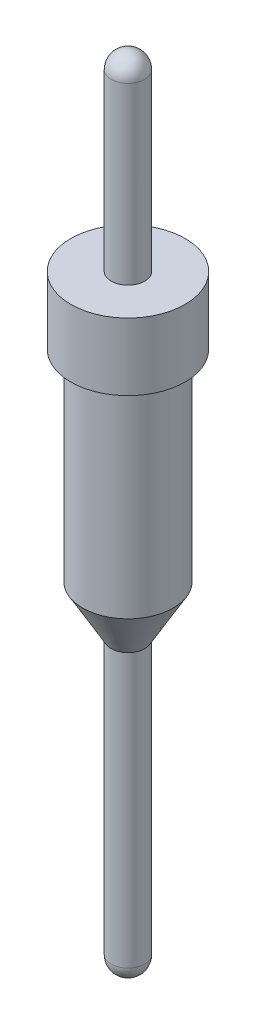
ISO-10303-21;
HEADER;
FILE_DESCRIPTION(('STEP AP214'),'2;1');
FILE_NAME('part.step','',(''),(''),'','','');
FILE_SCHEMA(('AUTOMOTIVE_DESIGN { 1 0 10303 214 1 1 1 1 }'));
ENDSEC;
DATA;
#1=APPLICATION_CONTEXT('core data for automotive mechanical design processes');
#2=APPLICATION_PROTOCOL_DEFINITION('international standard','automotive_design',2000,#1);
#3=PRODUCT_CONTEXT('',#1,'mechanical');
#4=PRODUCT('Part','Part','',(#3));
#5=PRODUCT_RELATED_PRODUCT_CATEGORY('part','',(#4));
#6=PRODUCT_DEFINITION_FORMATION('','',#4);
#7=PRODUCT_DEFINITION_CONTEXT('part definition',#1,'design');
#8=PRODUCT_DEFINITION('design','',#6,#7);
#9=PRODUCT_DEFINITION_SHAPE('','',#8);
#10=(LENGTH_UNIT() NAMED_UNIT(*) SI_UNIT(.MILLI.,.METRE.));
#11=(NAMED_UNIT(*) PLANE_ANGLE_UNIT() SI_UNIT($,.RADIAN.));
#12=(NAMED_UNIT(*) SI_UNIT($,.STERADIAN.) SOLID_ANGLE_UNIT());
#13=UNCERTAINTY_MEASURE_WITH_UNIT(LENGTH_MEASURE(1.E-05),#10,'distance_accuracy_value','');
#14=(GEOMETRIC_REPRESENTATION_CONTEXT(3) GLOBAL_UNCERTAINTY_ASSIGNED_CONTEXT((#13)) GLOBAL_UNIT_ASSIGNED_CONTEXT((#10,
#11,#12)) REPRESENTATION_CONTEXT('',''));
#15=CARTESIAN_POINT('',(0.,0.,0.));
#16=DIRECTION('',(0.,0.,1.));
#17=DIRECTION('',(1.,0.,0.));
#18=AXIS2_PLACEMENT_3D('',#15,#16,#17);
#19=CARTESIAN_POINT('',(-0.849999999999997,0.,0.));
#20=DIRECTION('',(0.,1.,0.));
#21=DIRECTION('',(0.,0.,1.));
#22=AXIS2_PLACEMENT_3D('',#19,#20,#21);
#23=PLANE('',#22);
#24=CARTESIAN_POINT('',(0.,0.,0.));
#25=DIRECTION('',(0.,1.,0.));
#26=DIRECTION('',(0.,0.,1.));
#27=AXIS2_PLACEMENT_3D('',#24,#25,#26);
#28=CIRCLE('',#27,0.849999999999997);
#29=CARTESIAN_POINT('',(0.,0.,0.849999999999997));
#30=VERTEX_POINT('',#29);
#31=EDGE_CURVE('E58',#30,#30,#28,.T.);
#32=ORIENTED_EDGE('',*,*,#31,.T.);
#33=EDGE_LOOP('',(#32));
#34=FACE_BOUND('',#33,.T.);
#35=CARTESIAN_POINT('',(0.,0.,0.));
#36=DIRECTION('',(0.,1.,0.));
#37=DIRECTION('',(0.,0.,1.));
#38=AXIS2_PLACEMENT_3D('',#35,#36,#37);
#39=CIRCLE('',#38,0.249999999999997);
#40=CARTESIAN_POINT('',(0.,0.,0.249999999999997));
#41=VERTEX_POINT('',#40);
#42=EDGE_CURVE('E10',#41,#41,#39,.T.);
#43=ORIENTED_EDGE('',*,*,#42,.F.);
#44=EDGE_LOOP('',(#43));
#45=FACE_BOUND('',#44,.T.);
#46=ADVANCED_FACE('F30',(#34,#45),#23,.T.);
#47=CARTESIAN_POINT('',(0.,28.992562867327,0.));
#48=DIRECTION('',(0.,1.,0.));
#49=DIRECTION('',(0.,0.,1.));
#50=AXIS2_PLACEMENT_3D('',#47,#48,#49);
#51=CYLINDRICAL_SURFACE('',#50,0.249999999999996);
#52=ORIENTED_EDGE('',*,*,#42,.T.);
#53=EDGE_LOOP('',(#52));
#54=FACE_BOUND('',#53,.T.);
#55=CARTESIAN_POINT('',(0.,2.6,0.));
#56=DIRECTION('',(0.,1.,0.));
#57=DIRECTION('',(0.,0.,1.));
#58=AXIS2_PLACEMENT_3D('',#55,#56,#57);
#59=CIRCLE('',#58,0.249999999999996);
#60=CARTESIAN_POINT('',(0.,2.6,0.249999999999996));
#61=VERTEX_POINT('',#60);
#62=EDGE_CURVE('E36',#61,#61,#59,.T.);
#63=ORIENTED_EDGE('',*,*,#62,.F.);
#64=EDGE_LOOP('',(#63));
#65=FACE_BOUND('',#64,.T.);
#66=ADVANCED_FACE('F76',(#54,#65),#51,.T.);
#67=CARTESIAN_POINT('',(0.,2.6,0.));
#68=DIRECTION('',(0.,1.,0.));
#69=DIRECTION('',(1.,0.,0.));
#70=AXIS2_PLACEMENT_3D('',#67,#68,#69);
#71=SPHERICAL_SURFACE('',#70,0.249999999999996);
#72=ORIENTED_EDGE('',*,*,#62,.T.);
#73=EDGE_LOOP('',(#72));
#74=FACE_BOUND('',#73,.T.);
#75=ADVANCED_FACE('F80',(#74),#71,.T.);
#76=CARTESIAN_POINT('',(0.,-8.8,0.));
#77=DIRECTION('',(0.,1.,0.));
#78=DIRECTION('',(-1.,0.,0.));
#79=AXIS2_PLACEMENT_3D('',#76,#77,#78);
#80=SPHERICAL_SURFACE('',#79,0.249999999999995);
#81=CARTESIAN_POINT('',(0.,-8.8,0.));
#82=DIRECTION('',(0.,1.,0.));
#83=DIRECTION('',(0.,0.,1.));
#84=AXIS2_PLACEMENT_3D('',#81,#82,#83);
#85=CIRCLE('',#84,0.249999999999995);
#86=CARTESIAN_POINT('',(0.,-8.8,0.249999999999995));
#87=VERTEX_POINT('',#86);
#88=EDGE_CURVE('E40',#87,#87,#85,.T.);
#89=ORIENTED_EDGE('',*,*,#88,.F.);
#90=EDGE_LOOP('',(#89));
#91=FACE_BOUND('',#90,.T.);
#92=ADVANCED_FACE('F84',(#91),#80,.T.);
#93=CARTESIAN_POINT('',(0.,28.992562867327,0.));
#94=DIRECTION('',(0.,1.,0.));
#95=DIRECTION('',(0.,0.,1.));
#96=AXIS2_PLACEMENT_3D('',#93,#94,#95);
#97=CYLINDRICAL_SURFACE('',#96,0.249999999999996);
#98=ORIENTED_EDGE('',*,*,#88,.T.);
#99=EDGE_LOOP('',(#98));
#100=FACE_BOUND('',#99,.T.);
#101=CARTESIAN_POINT('',(0.,-4.73612159321677,0.));
#102=DIRECTION('',(0.,1.,0.));
#103=DIRECTION('',(0.,0.,1.));
#104=AXIS2_PLACEMENT_3D('',#101,#102,#103);
#105=CIRCLE('',#104,0.249999999999996);
#106=CARTESIAN_POINT('',(0.,-4.73612159321677,0.249999999999996));
#107=VERTEX_POINT('',#106);
#108=EDGE_CURVE('E44',#107,#107,#105,.T.);
#109=ORIENTED_EDGE('',*,*,#108,.F.);
#110=EDGE_LOOP('',(#109));
#111=FACE_BOUND('',#110,.T.);
#112=ADVANCED_FACE('F90',(#100,#111),#97,.T.);
#113=CARTESIAN_POINT('',(0.,-4.,0.));
#114=DIRECTION('',(0.,1.,0.));
#115=DIRECTION('',(0.,0.,1.));
#116=AXIS2_PLACEMENT_3D('',#113,#114,#115);
#117=CONICAL_SURFACE('',#116,0.674999999999995,0.523598775598298);
#118=ORIENTED_EDGE('',*,*,#108,.T.);
#119=EDGE_LOOP('',(#118));
#120=FACE_BOUND('',#119,.T.);
#121=CARTESIAN_POINT('',(0.,-4.,0.));
#122=DIRECTION('',(0.,1.,0.));
#123=DIRECTION('',(0.,0.,1.));
#124=AXIS2_PLACEMENT_3D('',#121,#122,#123);
#125=CIRCLE('',#124,0.674999999999995);
#126=CARTESIAN_POINT('',(0.,-4.,0.674999999999995));
#127=VERTEX_POINT('',#126);
#128=EDGE_CURVE('E49',#127,#127,#125,.T.);
#129=ORIENTED_EDGE('',*,*,#128,.F.);
#130=EDGE_LOOP('',(#129));
#131=FACE_BOUND('',#130,.T.);
#132=ADVANCED_FACE('F94',(#120,#131),#117,.T.);
#133=CARTESIAN_POINT('',(0.,28.992562867327,0.));
#134=DIRECTION('',(0.,1.,0.));
#135=DIRECTION('',(0.,0.,1.));
#136=AXIS2_PLACEMENT_3D('',#133,#134,#135);
#137=CYLINDRICAL_SURFACE('',#136,0.674999999999996);
#138=ORIENTED_EDGE('',*,*,#128,.T.);
#139=EDGE_LOOP('',(#138));
#140=FACE_BOUND('',#139,.T.);
#141=CARTESIAN_POINT('',(0.,-1.,0.));
#142=DIRECTION('',(0.,1.,0.));
#143=DIRECTION('',(0.,0.,1.));
#144=AXIS2_PLACEMENT_3D('',#141,#142,#143);
#145=CIRCLE('',#144,0.674999999999996);
#146=CARTESIAN_POINT('',(0.,-1.,0.674999999999996));
#147=VERTEX_POINT('',#146);
#148=EDGE_CURVE('E52',#147,#147,#145,.T.);
#149=ORIENTED_EDGE('',*,*,#148,.F.);
#150=EDGE_LOOP('',(#149));
#151=FACE_BOUND('',#150,.T.);
#152=ADVANCED_FACE('F72',(#140,#151),#137,.T.);
#153=CARTESIAN_POINT('',(-0.849999999999996,-0.999999999999999,0.));
#154=DIRECTION('',(0.,-1.,0.));
#155=DIRECTION('',(0.,0.,-1.));
#156=AXIS2_PLACEMENT_3D('',#153,#154,#155);
#157=PLANE('',#156);
#158=ORIENTED_EDGE('',*,*,#148,.T.);
#159=EDGE_LOOP('',(#158));
#160=FACE_BOUND('',#159,.T.);
#161=CARTESIAN_POINT('',(0.,-1.,0.));
#162=DIRECTION('',(0.,1.,0.));
#163=DIRECTION('',(0.,0.,1.));
#164=AXIS2_PLACEMENT_3D('',#161,#162,#163);
#165=CIRCLE('',#164,0.849999999999996);
#166=CARTESIAN_POINT('',(0.,-1.,0.849999999999996));
#167=VERTEX_POINT('',#166);
#168=EDGE_CURVE('E55',#167,#167,#165,.T.);
#169=ORIENTED_EDGE('',*,*,#168,.F.);
#170=EDGE_LOOP('',(#169));
#171=FACE_BOUND('',#170,.T.);
#172=ADVANCED_FACE('F66',(#160,#171),#157,.T.);
#173=CARTESIAN_POINT('',(0.,28.992562867327,0.));
#174=DIRECTION('',(0.,1.,0.));
#175=DIRECTION('',(0.,0.,1.));
#176=AXIS2_PLACEMENT_3D('',#173,#174,#175);
#177=CYLINDRICAL_SURFACE('',#176,0.849999999999996);
#178=ORIENTED_EDGE('',*,*,#168,.T.);
#179=EDGE_LOOP('',(#178));
#180=FACE_BOUND('',#179,.T.);
#181=ORIENTED_EDGE('',*,*,#31,.F.);
#182=EDGE_LOOP('',(#181));
#183=FACE_BOUND('',#182,.T.);
#184=ADVANCED_FACE('F64',(#180,#183),#177,.T.);
#185=CLOSED_SHELL('',(#46,#66,#75,#92,#112,#132,#152,#172,#184));
#186=MANIFOLD_SOLID_BREP('B2',#185);
#187=ADVANCED_BREP_SHAPE_REPRESENTATION('',(#18,#186),#14);
#188=SHAPE_DEFINITION_REPRESENTATION(#9,#187);
ENDSEC;
END-ISO-10303-21;
